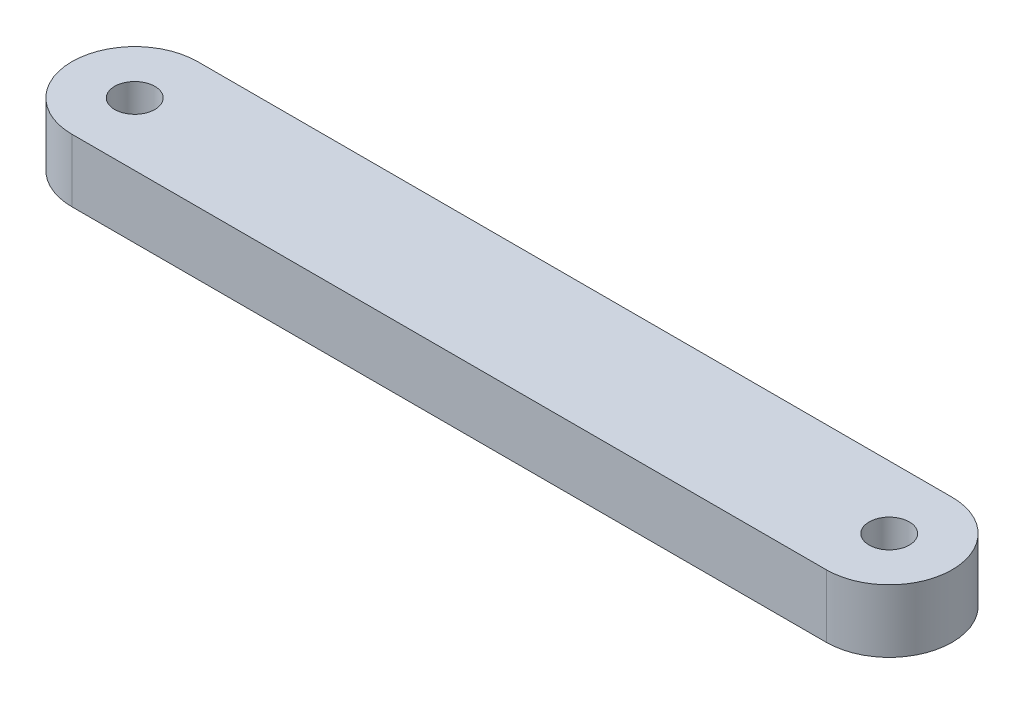
ISO-10303-21;
HEADER;
FILE_DESCRIPTION(('STEP AP214'),'2;1');
FILE_NAME('part.step','',(''),(''),'','','');
FILE_SCHEMA(('AUTOMOTIVE_DESIGN { 1 0 10303 214 1 1 1 1 }'));
ENDSEC;
DATA;
#1=APPLICATION_CONTEXT('core data for automotive mechanical design processes');
#2=APPLICATION_PROTOCOL_DEFINITION('international standard','automotive_design',2000,#1);
#3=PRODUCT_CONTEXT('',#1,'mechanical');
#4=PRODUCT('Part','Part','',(#3));
#5=PRODUCT_RELATED_PRODUCT_CATEGORY('part','',(#4));
#6=PRODUCT_DEFINITION_FORMATION('','',#4);
#7=PRODUCT_DEFINITION_CONTEXT('part definition',#1,'design');
#8=PRODUCT_DEFINITION('design','',#6,#7);
#9=PRODUCT_DEFINITION_SHAPE('','',#8);
#10=(LENGTH_UNIT() NAMED_UNIT(*) SI_UNIT(.MILLI.,.METRE.));
#11=(NAMED_UNIT(*) PLANE_ANGLE_UNIT() SI_UNIT($,.RADIAN.));
#12=(NAMED_UNIT(*) SI_UNIT($,.STERADIAN.) SOLID_ANGLE_UNIT());
#13=UNCERTAINTY_MEASURE_WITH_UNIT(LENGTH_MEASURE(1.E-05),#10,'distance_accuracy_value','');
#14=(GEOMETRIC_REPRESENTATION_CONTEXT(3) GLOBAL_UNCERTAINTY_ASSIGNED_CONTEXT((#13)) GLOBAL_UNIT_ASSIGNED_CONTEXT((#10,
#11,#12)) REPRESENTATION_CONTEXT('',''));
#15=CARTESIAN_POINT('',(0.,0.,0.));
#16=DIRECTION('',(0.,0.,1.));
#17=DIRECTION('',(1.,0.,0.));
#18=AXIS2_PLACEMENT_3D('',#15,#16,#17);
#19=CARTESIAN_POINT('',(60.,5.,0.));
#20=DIRECTION('',(0.,1.,0.));
#21=DIRECTION('',(0.,0.,1.));
#22=AXIS2_PLACEMENT_3D('',#19,#20,#21);
#23=PLANE('',#22);
#24=CARTESIAN_POINT('',(0.,5.,0.));
#25=DIRECTION('',(0.,1.,0.));
#26=DIRECTION('',(0.,0.,1.));
#27=AXIS2_PLACEMENT_3D('',#24,#25,#26);
#28=CIRCLE('',#27,1.6);
#29=CARTESIAN_POINT('',(0.,5.,1.6));
#30=VERTEX_POINT('',#29);
#31=EDGE_CURVE('E100',#30,#30,#28,.T.);
#32=ORIENTED_EDGE('',*,*,#31,.F.);
#33=EDGE_LOOP('',(#32));
#34=FACE_BOUND('',#33,.T.);
#35=CARTESIAN_POINT('',(60.,5.,0.));
#36=DIRECTION('',(0.,1.,0.));
#37=DIRECTION('',(0.,0.,1.));
#38=AXIS2_PLACEMENT_3D('',#35,#36,#37);
#39=CIRCLE('',#38,5.);
#40=CARTESIAN_POINT('',(60.,5.,5.));
#41=VERTEX_POINT('',#40);
#42=CARTESIAN_POINT('',(60.,5.,-5.));
#43=VERTEX_POINT('',#42);
#44=EDGE_CURVE('E85',#41,#43,#39,.T.);
#45=ORIENTED_EDGE('',*,*,#44,.T.);
#46=DIRECTION('',(-1.,0.,0.));
#47=VECTOR('',#46,1.);
#48=CARTESIAN_POINT('',(0.,5.,-5.));
#49=LINE('',#48,#47);
#50=CARTESIAN_POINT('',(0.,5.,-5.));
#51=VERTEX_POINT('',#50);
#52=EDGE_CURVE('E80',#43,#51,#49,.T.);
#53=ORIENTED_EDGE('',*,*,#52,.T.);
#54=CARTESIAN_POINT('',(0.,5.,0.));
#55=DIRECTION('',(0.,1.,0.));
#56=DIRECTION('',(0.,0.,1.));
#57=AXIS2_PLACEMENT_3D('',#54,#55,#56);
#58=CIRCLE('',#57,5.);
#59=CARTESIAN_POINT('',(0.,5.,5.));
#60=VERTEX_POINT('',#59);
#61=EDGE_CURVE('E83',#51,#60,#58,.T.);
#62=ORIENTED_EDGE('',*,*,#61,.T.);
#63=DIRECTION('',(1.,0.,0.));
#64=VECTOR('',#63,1.);
#65=CARTESIAN_POINT('',(0.,5.,5.));
#66=LINE('',#65,#64);
#67=EDGE_CURVE('E50',#60,#41,#66,.T.);
#68=ORIENTED_EDGE('',*,*,#67,.T.);
#69=EDGE_LOOP('',(#45,#53,#62,#68));
#70=FACE_BOUND('',#69,.T.);
#71=CARTESIAN_POINT('',(60.,5.,0.));
#72=DIRECTION('',(0.,1.,0.));
#73=DIRECTION('',(0.,0.,1.));
#74=AXIS2_PLACEMENT_3D('',#71,#72,#73);
#75=CIRCLE('',#74,1.60000000000001);
#76=CARTESIAN_POINT('',(60.,5.,1.60000000000001));
#77=VERTEX_POINT('',#76);
#78=EDGE_CURVE('E115',#77,#77,#75,.T.);
#79=ORIENTED_EDGE('',*,*,#78,.F.);
#80=EDGE_LOOP('',(#79));
#81=FACE_BOUND('',#80,.T.);
#82=ADVANCED_FACE('F33',(#34,#70,#81),#23,.T.);
#83=CARTESIAN_POINT('',(60.,0.,0.));
#84=DIRECTION('',(0.,1.,0.));
#85=DIRECTION('',(0.,0.,1.));
#86=AXIS2_PLACEMENT_3D('',#83,#84,#85);
#87=PLANE('',#86);
#88=CARTESIAN_POINT('',(60.,0.,0.));
#89=DIRECTION('',(0.,1.,0.));
#90=DIRECTION('',(0.,0.,1.));
#91=AXIS2_PLACEMENT_3D('',#88,#89,#90);
#92=CIRCLE('',#91,5.);
#93=CARTESIAN_POINT('',(60.,0.,5.));
#94=VERTEX_POINT('',#93);
#95=CARTESIAN_POINT('',(60.,0.,-5.));
#96=VERTEX_POINT('',#95);
#97=EDGE_CURVE('E97',#94,#96,#92,.T.);
#98=ORIENTED_EDGE('',*,*,#97,.F.);
#99=DIRECTION('',(1.,0.,0.));
#100=VECTOR('',#99,1.);
#101=CARTESIAN_POINT('',(0.,0.,5.));
#102=LINE('',#101,#100);
#103=CARTESIAN_POINT('',(0.,0.,5.));
#104=VERTEX_POINT('',#103);
#105=EDGE_CURVE('E73',#104,#94,#102,.T.);
#106=ORIENTED_EDGE('',*,*,#105,.F.);
#107=CARTESIAN_POINT('',(0.,0.,0.));
#108=DIRECTION('',(0.,1.,0.));
#109=DIRECTION('',(0.,0.,1.));
#110=AXIS2_PLACEMENT_3D('',#107,#108,#109);
#111=CIRCLE('',#110,5.);
#112=CARTESIAN_POINT('',(0.,0.,-5.));
#113=VERTEX_POINT('',#112);
#114=EDGE_CURVE('E67',#113,#104,#111,.T.);
#115=ORIENTED_EDGE('',*,*,#114,.F.);
#116=DIRECTION('',(-1.,0.,0.));
#117=VECTOR('',#116,1.);
#118=CARTESIAN_POINT('',(0.,0.,-5.));
#119=LINE('',#118,#117);
#120=EDGE_CURVE('E89',#96,#113,#119,.T.);
#121=ORIENTED_EDGE('',*,*,#120,.F.);
#122=EDGE_LOOP('',(#98,#106,#115,#121));
#123=FACE_BOUND('',#122,.T.);
#124=CARTESIAN_POINT('',(0.,0.,0.));
#125=DIRECTION('',(0.,1.,0.));
#126=DIRECTION('',(0.,0.,1.));
#127=AXIS2_PLACEMENT_3D('',#124,#125,#126);
#128=CIRCLE('',#127,1.6);
#129=CARTESIAN_POINT('',(0.,0.,1.6));
#130=VERTEX_POINT('',#129);
#131=EDGE_CURVE('E112',#130,#130,#128,.T.);
#132=ORIENTED_EDGE('',*,*,#131,.T.);
#133=EDGE_LOOP('',(#132));
#134=FACE_BOUND('',#133,.T.);
#135=CARTESIAN_POINT('',(60.,0.,0.));
#136=DIRECTION('',(0.,1.,0.));
#137=DIRECTION('',(0.,0.,1.));
#138=AXIS2_PLACEMENT_3D('',#135,#136,#137);
#139=CIRCLE('',#138,1.60000000000001);
#140=CARTESIAN_POINT('',(60.,0.,1.60000000000001));
#141=VERTEX_POINT('',#140);
#142=EDGE_CURVE('E118',#141,#141,#139,.T.);
#143=ORIENTED_EDGE('',*,*,#142,.T.);
#144=EDGE_LOOP('',(#143));
#145=FACE_BOUND('',#144,.T.);
#146=ADVANCED_FACE('F108',(#123,#134,#145),#87,.F.);
#147=CARTESIAN_POINT('',(60.,5.,0.));
#148=DIRECTION('',(0.,-1.,0.));
#149=DIRECTION('',(0.,0.,-1.));
#150=AXIS2_PLACEMENT_3D('',#147,#148,#149);
#151=CYLINDRICAL_SURFACE('',#150,5.);
#152=ORIENTED_EDGE('',*,*,#97,.T.);
#153=DIRECTION('',(0.,-1.,0.));
#154=VECTOR('',#153,1.);
#155=CARTESIAN_POINT('',(60.,5.,-5.));
#156=LINE('',#155,#154);
#157=EDGE_CURVE('E11',#43,#96,#156,.T.);
#158=ORIENTED_EDGE('',*,*,#157,.F.);
#159=ORIENTED_EDGE('',*,*,#44,.F.);
#160=DIRECTION('',(0.,-1.,0.));
#161=VECTOR('',#160,1.);
#162=CARTESIAN_POINT('',(60.,5.,5.));
#163=LINE('',#162,#161);
#164=EDGE_CURVE('E93',#41,#94,#163,.T.);
#165=ORIENTED_EDGE('',*,*,#164,.T.);
#166=EDGE_LOOP('',(#152,#158,#159,#165));
#167=FACE_BOUND('',#166,.T.);
#168=ADVANCED_FACE('F35',(#167),#151,.T.);
#169=CARTESIAN_POINT('',(0.,5.,-5.));
#170=DIRECTION('',(0.,0.,1.));
#171=DIRECTION('',(1.,0.,0.));
#172=AXIS2_PLACEMENT_3D('',#169,#170,#171);
#173=PLANE('',#172);
#174=ORIENTED_EDGE('',*,*,#120,.T.);
#175=DIRECTION('',(0.,-1.,0.));
#176=VECTOR('',#175,1.);
#177=CARTESIAN_POINT('',(0.,5.,-5.));
#178=LINE('',#177,#176);
#179=EDGE_CURVE('E42',#51,#113,#178,.T.);
#180=ORIENTED_EDGE('',*,*,#179,.F.);
#181=ORIENTED_EDGE('',*,*,#52,.F.);
#182=ORIENTED_EDGE('',*,*,#157,.T.);
#183=EDGE_LOOP('',(#174,#180,#181,#182));
#184=FACE_BOUND('',#183,.T.);
#185=ADVANCED_FACE('F88',(#184),#173,.F.);
#186=CARTESIAN_POINT('',(0.,5.,0.));
#187=DIRECTION('',(0.,-1.,0.));
#188=DIRECTION('',(0.,0.,-1.));
#189=AXIS2_PLACEMENT_3D('',#186,#187,#188);
#190=CYLINDRICAL_SURFACE('',#189,5.);
#191=ORIENTED_EDGE('',*,*,#114,.T.);
#192=DIRECTION('',(0.,-1.,0.));
#193=VECTOR('',#192,1.);
#194=CARTESIAN_POINT('',(0.,5.,5.));
#195=LINE('',#194,#193);
#196=EDGE_CURVE('E90',#60,#104,#195,.T.);
#197=ORIENTED_EDGE('',*,*,#196,.F.);
#198=ORIENTED_EDGE('',*,*,#61,.F.);
#199=ORIENTED_EDGE('',*,*,#179,.T.);
#200=EDGE_LOOP('',(#191,#197,#198,#199));
#201=FACE_BOUND('',#200,.T.);
#202=ADVANCED_FACE('F91',(#201),#190,.T.);
#203=CARTESIAN_POINT('',(0.,5.,5.));
#204=DIRECTION('',(0.,0.,-1.));
#205=DIRECTION('',(-1.,0.,0.));
#206=AXIS2_PLACEMENT_3D('',#203,#204,#205);
#207=PLANE('',#206);
#208=ORIENTED_EDGE('',*,*,#105,.T.);
#209=ORIENTED_EDGE('',*,*,#164,.F.);
#210=ORIENTED_EDGE('',*,*,#67,.F.);
#211=ORIENTED_EDGE('',*,*,#196,.T.);
#212=EDGE_LOOP('',(#208,#209,#210,#211));
#213=FACE_BOUND('',#212,.T.);
#214=ADVANCED_FACE('F105',(#213),#207,.F.);
#215=CARTESIAN_POINT('',(0.,5.,0.));
#216=DIRECTION('',(0.,-1.,0.));
#217=DIRECTION('',(0.,0.,-1.));
#218=AXIS2_PLACEMENT_3D('',#215,#216,#217);
#219=CYLINDRICAL_SURFACE('',#218,1.6);
#220=ORIENTED_EDGE('',*,*,#31,.T.);
#221=EDGE_LOOP('',(#220));
#222=FACE_BOUND('',#221,.T.);
#223=ORIENTED_EDGE('',*,*,#131,.F.);
#224=EDGE_LOOP('',(#223));
#225=FACE_BOUND('',#224,.T.);
#226=ADVANCED_FACE('F135',(#222,#225),#219,.F.);
#227=CARTESIAN_POINT('',(60.,5.,0.));
#228=DIRECTION('',(0.,-1.,0.));
#229=DIRECTION('',(0.,0.,-1.));
#230=AXIS2_PLACEMENT_3D('',#227,#228,#229);
#231=CYLINDRICAL_SURFACE('',#230,1.60000000000001);
#232=ORIENTED_EDGE('',*,*,#78,.T.);
#233=EDGE_LOOP('',(#232));
#234=FACE_BOUND('',#233,.T.);
#235=ORIENTED_EDGE('',*,*,#142,.F.);
#236=EDGE_LOOP('',(#235));
#237=FACE_BOUND('',#236,.T.);
#238=ADVANCED_FACE('F124',(#234,#237),#231,.F.);
#239=CLOSED_SHELL('',(#82,#146,#168,#185,#202,#214,#226,#238));
#240=MANIFOLD_SOLID_BREP('B2',#239);
#241=ADVANCED_BREP_SHAPE_REPRESENTATION('',(#18,#240),#14);
#242=SHAPE_DEFINITION_REPRESENTATION(#9,#241);
ENDSEC;
END-ISO-10303-21;
